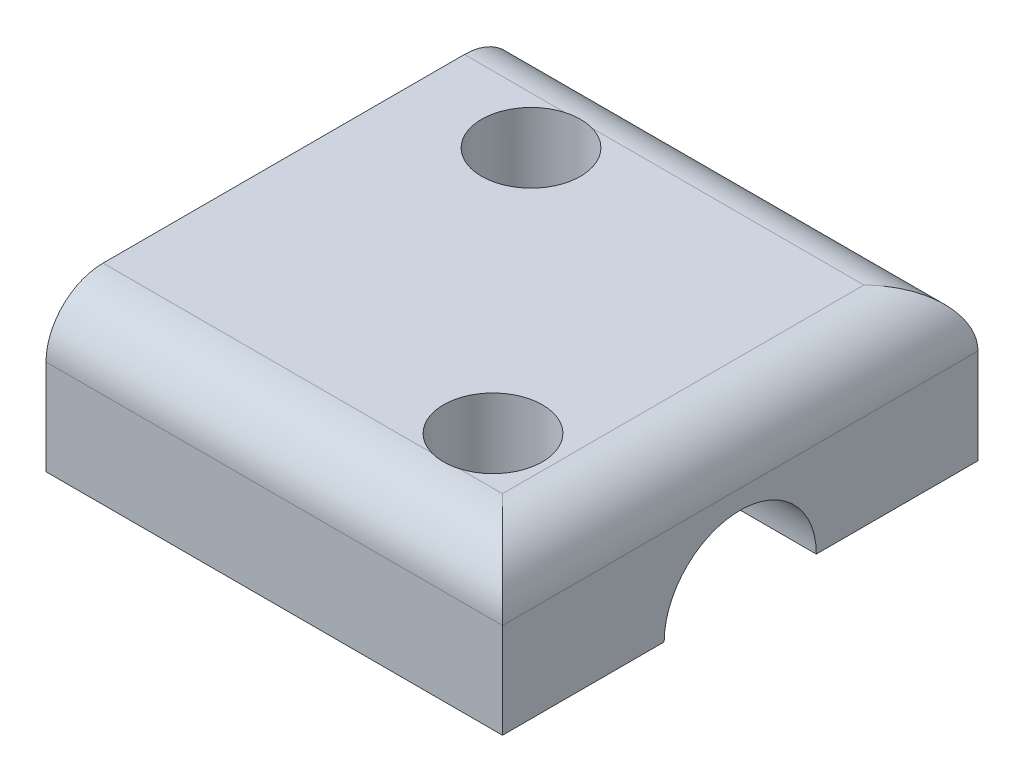
ISO-10303-21;
HEADER;
FILE_DESCRIPTION(('STEP AP214'),'2;1');
FILE_NAME('part.step','',(''),(''),'','','');
FILE_SCHEMA(('AUTOMOTIVE_DESIGN { 1 0 10303 214 1 1 1 1 }'));
ENDSEC;
DATA;
#1=APPLICATION_CONTEXT('core data for automotive mechanical design processes');
#2=APPLICATION_PROTOCOL_DEFINITION('international standard','automotive_design',2000,#1);
#3=PRODUCT_CONTEXT('',#1,'mechanical');
#4=PRODUCT('Part','Part','',(#3));
#5=PRODUCT_RELATED_PRODUCT_CATEGORY('part','',(#4));
#6=PRODUCT_DEFINITION_FORMATION('','',#4);
#7=PRODUCT_DEFINITION_CONTEXT('part definition',#1,'design');
#8=PRODUCT_DEFINITION('design','',#6,#7);
#9=PRODUCT_DEFINITION_SHAPE('','',#8);
#10=(LENGTH_UNIT() NAMED_UNIT(*) SI_UNIT(.MILLI.,.METRE.));
#11=(NAMED_UNIT(*) PLANE_ANGLE_UNIT() SI_UNIT($,.RADIAN.));
#12=(NAMED_UNIT(*) SI_UNIT($,.STERADIAN.) SOLID_ANGLE_UNIT());
#13=UNCERTAINTY_MEASURE_WITH_UNIT(LENGTH_MEASURE(1.E-05),#10,'distance_accuracy_value','');
#14=(GEOMETRIC_REPRESENTATION_CONTEXT(3) GLOBAL_UNCERTAINTY_ASSIGNED_CONTEXT((#13)) GLOBAL_UNIT_ASSIGNED_CONTEXT((#10,
#11,#12)) REPRESENTATION_CONTEXT('',''));
#15=CARTESIAN_POINT('',(0.,0.,0.));
#16=DIRECTION('',(0.,0.,1.));
#17=DIRECTION('',(1.,0.,0.));
#18=AXIS2_PLACEMENT_3D('',#15,#16,#17);
#19=CARTESIAN_POINT('',(0.,0.,0.));
#20=DIRECTION('',(0.,1.,0.));
#21=DIRECTION('',(0.,0.,1.));
#22=AXIS2_PLACEMENT_3D('',#19,#20,#21);
#23=PLANE('',#22);
#24=CARTESIAN_POINT('',(-6.,0.,-6.99999999999998));
#25=DIRECTION('',(0.,-1.,0.));
#26=DIRECTION('',(0.,0.,-1.));
#27=AXIS2_PLACEMENT_3D('',#24,#25,#26);
#28=CIRCLE('',#27,2.6);
#29=CARTESIAN_POINT('',(-6.,0.,-9.59999999999998));
#30=VERTEX_POINT('',#29);
#31=EDGE_CURVE('E227',#30,#30,#28,.T.);
#32=ORIENTED_EDGE('',*,*,#31,.F.);
#33=EDGE_LOOP('',(#32));
#34=FACE_BOUND('',#33,.T.);
#35=DIRECTION('',(0.,0.,-1.));
#36=VECTOR('',#35,1.);
#37=CARTESIAN_POINT('',(12.,0.,-12.5));
#38=LINE('',#37,#36);
#39=CARTESIAN_POINT('',(12.,0.,-4.00000000000001));
#40=VERTEX_POINT('',#39);
#41=CARTESIAN_POINT('',(12.,0.,-12.5));
#42=VERTEX_POINT('',#41);
#43=EDGE_CURVE('E231',#40,#42,#38,.T.);
#44=ORIENTED_EDGE('',*,*,#43,.F.);
#45=DIRECTION('',(-1.,0.,0.));
#46=VECTOR('',#45,1.);
#47=CARTESIAN_POINT('',(12.,0.,-4.));
#48=LINE('',#47,#46);
#49=CARTESIAN_POINT('',(-12.,0.,-4.));
#50=VERTEX_POINT('',#49);
#51=EDGE_CURVE('E133',#40,#50,#48,.T.);
#52=ORIENTED_EDGE('',*,*,#51,.T.);
#53=DIRECTION('',(0.,0.,1.));
#54=VECTOR('',#53,1.);
#55=CARTESIAN_POINT('',(-12.,0.,-12.5));
#56=LINE('',#55,#54);
#57=CARTESIAN_POINT('',(-12.,0.,-12.5));
#58=VERTEX_POINT('',#57);
#59=EDGE_CURVE('E145',#58,#50,#56,.T.);
#60=ORIENTED_EDGE('',*,*,#59,.F.);
#61=DIRECTION('',(-1.,0.,0.));
#62=VECTOR('',#61,1.);
#63=CARTESIAN_POINT('',(-12.,0.,-12.5));
#64=LINE('',#63,#62);
#65=EDGE_CURVE('E151',#42,#58,#64,.T.);
#66=ORIENTED_EDGE('',*,*,#65,.F.);
#67=EDGE_LOOP('',(#44,#52,#60,#66));
#68=FACE_BOUND('',#67,.T.);
#69=ADVANCED_FACE('F43',(#34,#68),#23,.F.);
#70=CARTESIAN_POINT('',(12.,8.,-12.5));
#71=DIRECTION('',(-1.,0.,0.));
#72=DIRECTION('',(0.,0.,1.));
#73=AXIS2_PLACEMENT_3D('',#70,#71,#72);
#74=PLANE('',#73);
#75=DIRECTION('',(0.,-1.,0.));
#76=VECTOR('',#75,1.);
#77=CARTESIAN_POINT('',(12.,8.,-12.5));
#78=LINE('',#77,#76);
#79=CARTESIAN_POINT('',(12.,5.,-12.5));
#80=VERTEX_POINT('',#79);
#81=EDGE_CURVE('E134',#80,#42,#78,.T.);
#82=ORIENTED_EDGE('',*,*,#81,.F.);
#83=DIRECTION('',(0.,0.,-1.));
#84=VECTOR('',#83,1.);
#85=CARTESIAN_POINT('',(12.,5.,12.5));
#86=LINE('',#85,#84);
#87=CARTESIAN_POINT('',(12.,5.,12.5));
#88=VERTEX_POINT('',#87);
#89=EDGE_CURVE('E61',#80,#88,#86,.F.);
#90=ORIENTED_EDGE('',*,*,#89,.T.);
#91=DIRECTION('',(0.,-1.,0.));
#92=VECTOR('',#91,1.);
#93=CARTESIAN_POINT('',(12.,8.,12.5));
#94=LINE('',#93,#92);
#95=CARTESIAN_POINT('',(12.,0.,12.5));
#96=VERTEX_POINT('',#95);
#97=EDGE_CURVE('E160',#88,#96,#94,.T.);
#98=ORIENTED_EDGE('',*,*,#97,.T.);
#99=CARTESIAN_POINT('',(12.,0.,3.99999999999999));
#100=VERTEX_POINT('',#99);
#101=EDGE_CURVE('E154',#96,#100,#38,.T.);
#102=ORIENTED_EDGE('',*,*,#101,.T.);
#103=CARTESIAN_POINT('',(12.,0.,0.));
#104=DIRECTION('',(-1.,0.,0.));
#105=DIRECTION('',(0.,0.,1.));
#106=AXIS2_PLACEMENT_3D('',#103,#104,#105);
#107=CIRCLE('',#106,4.);
#108=EDGE_CURVE('E128',#100,#40,#107,.T.);
#109=ORIENTED_EDGE('',*,*,#108,.T.);
#110=ORIENTED_EDGE('',*,*,#43,.T.);
#111=EDGE_LOOP('',(#82,#90,#98,#102,#109,#110));
#112=FACE_BOUND('',#111,.T.);
#113=ADVANCED_FACE('F237',(#112),#74,.F.);
#114=CARTESIAN_POINT('',(-12.,8.,-12.5));
#115=DIRECTION('',(0.,0.,1.));
#116=DIRECTION('',(1.,0.,0.));
#117=AXIS2_PLACEMENT_3D('',#114,#115,#116);
#118=PLANE('',#117);
#119=DIRECTION('',(0.,-1.,0.));
#120=VECTOR('',#119,1.);
#121=CARTESIAN_POINT('',(-12.,8.,-12.5));
#122=LINE('',#121,#120);
#123=CARTESIAN_POINT('',(-12.,5.,-12.5));
#124=VERTEX_POINT('',#123);
#125=EDGE_CURVE('E164',#124,#58,#122,.T.);
#126=ORIENTED_EDGE('',*,*,#125,.F.);
#127=DIRECTION('',(-1.,0.,0.));
#128=VECTOR('',#127,1.);
#129=CARTESIAN_POINT('',(12.,5.,-12.5));
#130=LINE('',#129,#128);
#131=EDGE_CURVE('E69',#124,#80,#130,.F.);
#132=ORIENTED_EDGE('',*,*,#131,.T.);
#133=ORIENTED_EDGE('',*,*,#81,.T.);
#134=ORIENTED_EDGE('',*,*,#65,.T.);
#135=EDGE_LOOP('',(#126,#132,#133,#134));
#136=FACE_BOUND('',#135,.T.);
#137=ADVANCED_FACE('F239',(#136),#118,.F.);
#138=CARTESIAN_POINT('',(-12.,8.,-12.5));
#139=DIRECTION('',(1.,0.,0.));
#140=DIRECTION('',(0.,0.,-1.));
#141=AXIS2_PLACEMENT_3D('',#138,#139,#140);
#142=PLANE('',#141);
#143=DIRECTION('',(0.,0.,1.));
#144=VECTOR('',#143,1.);
#145=CARTESIAN_POINT('',(-12.,8.,-12.5));
#146=LINE('',#145,#144);
#147=CARTESIAN_POINT('',(-12.,8.,-9.5));
#148=VERTEX_POINT('',#147);
#149=CARTESIAN_POINT('',(-12.,8.,9.5));
#150=VERTEX_POINT('',#149);
#151=EDGE_CURVE('E159',#148,#150,#146,.T.);
#152=ORIENTED_EDGE('',*,*,#151,.F.);
#153=CARTESIAN_POINT('',(-12.,5.,-9.5));
#154=DIRECTION('',(1.,0.,0.));
#155=DIRECTION('',(0.,0.,-1.));
#156=AXIS2_PLACEMENT_3D('',#153,#154,#155);
#157=CIRCLE('',#156,3.);
#158=EDGE_CURVE('E242',#148,#124,#157,.F.);
#159=ORIENTED_EDGE('',*,*,#158,.T.);
#160=ORIENTED_EDGE('',*,*,#125,.T.);
#161=ORIENTED_EDGE('',*,*,#59,.T.);
#162=CARTESIAN_POINT('',(-12.,0.,0.));
#163=DIRECTION('',(-1.,0.,0.));
#164=DIRECTION('',(0.,0.,1.));
#165=AXIS2_PLACEMENT_3D('',#162,#163,#164);
#166=CIRCLE('',#165,4.);
#167=CARTESIAN_POINT('',(-12.,0.,4.));
#168=VERTEX_POINT('',#167);
#169=EDGE_CURVE('E125',#168,#50,#166,.T.);
#170=ORIENTED_EDGE('',*,*,#169,.F.);
#171=CARTESIAN_POINT('',(-12.,0.,12.5));
#172=VERTEX_POINT('',#171);
#173=EDGE_CURVE('E142',#168,#172,#56,.T.);
#174=ORIENTED_EDGE('',*,*,#173,.T.);
#175=DIRECTION('',(0.,-1.,0.));
#176=VECTOR('',#175,1.);
#177=CARTESIAN_POINT('',(-12.,8.,12.5));
#178=LINE('',#177,#176);
#179=CARTESIAN_POINT('',(-12.,5.,12.5));
#180=VERTEX_POINT('',#179);
#181=EDGE_CURVE('E162',#180,#172,#178,.T.);
#182=ORIENTED_EDGE('',*,*,#181,.F.);
#183=CARTESIAN_POINT('',(-12.,5.,9.5));
#184=DIRECTION('',(1.,0.,0.));
#185=DIRECTION('',(0.,0.,-1.));
#186=AXIS2_PLACEMENT_3D('',#183,#184,#185);
#187=CIRCLE('',#186,3.);
#188=EDGE_CURVE('E187',#180,#150,#187,.F.);
#189=ORIENTED_EDGE('',*,*,#188,.T.);
#190=EDGE_LOOP('',(#152,#159,#160,#161,#170,#174,#182,#189));
#191=FACE_BOUND('',#190,.T.);
#192=ADVANCED_FACE('F140',(#191),#142,.F.);
#193=CARTESIAN_POINT('',(-12.,8.,12.5));
#194=DIRECTION('',(0.,0.,-1.));
#195=DIRECTION('',(-1.,0.,0.));
#196=AXIS2_PLACEMENT_3D('',#193,#194,#195);
#197=PLANE('',#196);
#198=ORIENTED_EDGE('',*,*,#97,.F.);
#199=DIRECTION('',(1.,0.,0.));
#200=VECTOR('',#199,1.);
#201=CARTESIAN_POINT('',(-12.,5.,12.5));
#202=LINE('',#201,#200);
#203=EDGE_CURVE('E11',#88,#180,#202,.F.);
#204=ORIENTED_EDGE('',*,*,#203,.T.);
#205=ORIENTED_EDGE('',*,*,#181,.T.);
#206=DIRECTION('',(1.,0.,0.));
#207=VECTOR('',#206,1.);
#208=CARTESIAN_POINT('',(-12.,0.,12.5));
#209=LINE('',#208,#207);
#210=EDGE_CURVE('E150',#172,#96,#209,.T.);
#211=ORIENTED_EDGE('',*,*,#210,.T.);
#212=EDGE_LOOP('',(#198,#204,#205,#211));
#213=FACE_BOUND('',#212,.T.);
#214=ADVANCED_FACE('F260',(#213),#197,.F.);
#215=CARTESIAN_POINT('',(0.,8.,0.));
#216=DIRECTION('',(0.,1.,0.));
#217=DIRECTION('',(0.,0.,1.));
#218=AXIS2_PLACEMENT_3D('',#215,#216,#217);
#219=PLANE('',#218);
#220=CARTESIAN_POINT('',(-6.,8.,-6.99999999999998));
#221=DIRECTION('',(0.,-1.,0.));
#222=DIRECTION('',(0.,0.,-1.));
#223=AXIS2_PLACEMENT_3D('',#220,#221,#222);
#224=CIRCLE('',#223,2.6);
#225=CARTESIAN_POINT('',(-5.28585715714578,8.,-9.5));
#226=VERTEX_POINT('',#225);
#227=CARTESIAN_POINT('',(-6.71414284285422,8.,-9.5));
#228=VERTEX_POINT('',#227);
#229=EDGE_CURVE('E146',#226,#228,#224,.T.);
#230=ORIENTED_EDGE('',*,*,#229,.T.);
#231=DIRECTION('',(-1.,0.,0.));
#232=VECTOR('',#231,1.);
#233=CARTESIAN_POINT('',(-12.,8.,-9.5));
#234=LINE('',#233,#232);
#235=EDGE_CURVE('E177',#228,#148,#234,.T.);
#236=ORIENTED_EDGE('',*,*,#235,.T.);
#237=ORIENTED_EDGE('',*,*,#151,.T.);
#238=DIRECTION('',(1.,0.,0.));
#239=VECTOR('',#238,1.);
#240=CARTESIAN_POINT('',(12.,8.,9.5));
#241=LINE('',#240,#239);
#242=CARTESIAN_POINT('',(5.28585715714565,8.,9.5));
#243=VERTEX_POINT('',#242);
#244=EDGE_CURVE('E175',#150,#243,#241,.T.);
#245=ORIENTED_EDGE('',*,*,#244,.T.);
#246=CARTESIAN_POINT('',(5.99999999999999,8.,7.00000000000002));
#247=DIRECTION('',(0.,-1.,0.));
#248=DIRECTION('',(0.,0.,-1.));
#249=AXIS2_PLACEMENT_3D('',#246,#247,#248);
#250=CIRCLE('',#249,2.6);
#251=CARTESIAN_POINT('',(6.71414284285434,8.,9.5));
#252=VERTEX_POINT('',#251);
#253=EDGE_CURVE('E216',#243,#252,#250,.T.);
#254=ORIENTED_EDGE('',*,*,#253,.T.);
#255=DIRECTION('',(1.,0.,0.));
#256=VECTOR('',#255,1.);
#257=CARTESIAN_POINT('',(12.,8.,9.5));
#258=LINE('',#257,#256);
#259=CARTESIAN_POINT('',(9.,8.,9.5));
#260=VERTEX_POINT('',#259);
#261=EDGE_CURVE('E168',#252,#260,#258,.T.);
#262=ORIENTED_EDGE('',*,*,#261,.T.);
#263=DIRECTION('',(0.,0.,-1.));
#264=VECTOR('',#263,1.);
#265=CARTESIAN_POINT('',(9.,8.,-12.5));
#266=LINE('',#265,#264);
#267=CARTESIAN_POINT('',(9.,8.,-9.5));
#268=VERTEX_POINT('',#267);
#269=EDGE_CURVE('E170',#260,#268,#266,.T.);
#270=ORIENTED_EDGE('',*,*,#269,.T.);
#271=DIRECTION('',(-1.,0.,0.));
#272=VECTOR('',#271,1.);
#273=CARTESIAN_POINT('',(-12.,8.,-9.5));
#274=LINE('',#273,#272);
#275=EDGE_CURVE('E172',#268,#226,#274,.T.);
#276=ORIENTED_EDGE('',*,*,#275,.T.);
#277=EDGE_LOOP('',(#230,#236,#237,#245,#254,#262,#270,#276));
#278=FACE_BOUND('',#277,.T.);
#279=ADVANCED_FACE('F248',(#278),#219,.T.);
#280=CARTESIAN_POINT('',(5.99999999999999,0.,7.00000000000002));
#281=DIRECTION('',(0.,-1.,0.));
#282=DIRECTION('',(0.,0.,-1.));
#283=AXIS2_PLACEMENT_3D('',#280,#281,#282);
#284=CIRCLE('',#283,2.6);
#285=CARTESIAN_POINT('',(5.99999999999999,0.,4.40000000000001));
#286=VERTEX_POINT('',#285);
#287=EDGE_CURVE('E221',#286,#286,#284,.T.);
#288=ORIENTED_EDGE('',*,*,#287,.F.);
#289=EDGE_LOOP('',(#288));
#290=FACE_BOUND('',#289,.T.);
#291=ORIENTED_EDGE('',*,*,#173,.F.);
#292=DIRECTION('',(-1.,0.,0.));
#293=VECTOR('',#292,1.);
#294=CARTESIAN_POINT('',(12.,0.,3.99999999999999));
#295=LINE('',#294,#293);
#296=EDGE_CURVE('E122',#168,#100,#295,.F.);
#297=ORIENTED_EDGE('',*,*,#296,.T.);
#298=ORIENTED_EDGE('',*,*,#101,.F.);
#299=ORIENTED_EDGE('',*,*,#210,.F.);
#300=EDGE_LOOP('',(#291,#297,#298,#299));
#301=FACE_BOUND('',#300,.T.);
#302=ADVANCED_FACE('F148',(#290,#301),#23,.F.);
#303=CARTESIAN_POINT('',(12.,0.,0.));
#304=DIRECTION('',(-1.,0.,0.));
#305=DIRECTION('',(0.,0.,1.));
#306=AXIS2_PLACEMENT_3D('',#303,#304,#305);
#307=CYLINDRICAL_SURFACE('',#306,4.);
#308=ORIENTED_EDGE('',*,*,#108,.F.);
#309=ORIENTED_EDGE('',*,*,#296,.F.);
#310=ORIENTED_EDGE('',*,*,#169,.T.);
#311=ORIENTED_EDGE('',*,*,#51,.F.);
#312=EDGE_LOOP('',(#308,#309,#310,#311));
#313=FACE_BOUND('',#312,.T.);
#314=ADVANCED_FACE('F124',(#313),#307,.F.);
#315=CARTESIAN_POINT('',(5.99999999999999,8.,7.00000000000002));
#316=DIRECTION('',(0.,-1.,0.));
#317=DIRECTION('',(0.,0.,-1.));
#318=AXIS2_PLACEMENT_3D('',#315,#316,#317);
#319=CYLINDRICAL_SURFACE('',#318,2.6);
#320=ORIENTED_EDGE('',*,*,#253,.F.);
#321=CARTESIAN_POINT('',(5.28585715714565,8.,9.5));
#322=CARTESIAN_POINT('',(5.35694919625492,7.99998041833804,9.52031619109937));
#323=CARTESIAN_POINT('',(5.42890987822449,7.99979278980155,9.5375841845331));
#324=CARTESIAN_POINT('',(5.57405455969822,7.99931410750979,9.56593617730904));
#325=CARTESIAN_POINT('',(5.64723880714189,7.99902303254433,9.57701890725487));
#326=CARTESIAN_POINT('',(5.79260665753235,7.99857549826108,9.59272283319133));
#327=CARTESIAN_POINT('',(5.86477490245482,7.99841611435178,9.59748591817973));
#328=CARTESIAN_POINT('',(6.00922505909283,7.99830035195138,9.60098731820107));
#329=CARTESIAN_POINT('',(6.08150692629877,7.99834390756972,9.59972758872249));
#330=CARTESIAN_POINT('',(6.24769287166116,7.99865965182706,9.58988764866424));
#331=CARTESIAN_POINT('',(6.34148438040999,7.99899737142083,9.57919675295137));
#332=CARTESIAN_POINT('',(6.48154908654678,7.99949706327471,9.55546556852627));
#333=CARTESIAN_POINT('',(6.52849032246857,7.99966372750928,9.54617119530564));
#334=CARTESIAN_POINT('',(6.62178581615362,7.99991404375928,9.52500862847828));
#335=CARTESIAN_POINT('',(6.66814011396776,7.99999770146929,9.51314061150187));
#336=CARTESIAN_POINT('',(6.71414284285434,8.,9.5));
#337=B_SPLINE_CURVE_WITH_KNOTS('',3,(#321,#322,#323,#324,#325,#326,#327,#328,#329,#330,#331,
#332,#333,#334,#335,#336),.UNSPECIFIED.,.F.,.F.,(4,2,2,2,2,2,2,4),(0.,0.221743370898095,
0.443532233280988,0.660252121844597,0.876901650535021,1.15946810324269,1.30296503050942,
1.44645211263273),.UNSPECIFIED.);
#338=EDGE_CURVE('E53',#243,#252,#337,.T.);
#339=ORIENTED_EDGE('',*,*,#338,.T.);
#340=EDGE_LOOP('',(#320,#339));
#341=FACE_BOUND('',#340,.T.);
#342=ORIENTED_EDGE('',*,*,#287,.T.);
#343=EDGE_LOOP('',(#342));
#344=FACE_BOUND('',#343,.T.);
#345=ADVANCED_FACE('F196',(#341,#344),#319,.F.);
#346=CARTESIAN_POINT('',(-6.,8.,-6.99999999999998));
#347=DIRECTION('',(0.,-1.,0.));
#348=DIRECTION('',(0.,0.,-1.));
#349=AXIS2_PLACEMENT_3D('',#346,#347,#348);
#350=CYLINDRICAL_SURFACE('',#349,2.6);
#351=ORIENTED_EDGE('',*,*,#229,.F.);
#352=CARTESIAN_POINT('',(-5.28585715714578,8.,-9.5));
#353=CARTESIAN_POINT('',(-5.35694919625505,7.99998041833804,-9.52031619109937));
#354=CARTESIAN_POINT('',(-5.42890987822462,7.99979278980155,-9.5375841845331));
#355=CARTESIAN_POINT('',(-5.57405455969835,7.99931410750979,-9.56593617730902));
#356=CARTESIAN_POINT('',(-5.64723880714202,7.99902303254433,-9.57701890725485));
#357=CARTESIAN_POINT('',(-5.79260665753248,7.99857549826108,-9.5927228331913));
#358=CARTESIAN_POINT('',(-5.86477490245495,7.99841611435178,-9.59748591817971));
#359=CARTESIAN_POINT('',(-6.00922505909296,7.99830035195138,-9.60098731820103));
#360=CARTESIAN_POINT('',(-6.0815069262989,7.99834390756973,-9.59972758872245));
#361=CARTESIAN_POINT('',(-6.24769287166125,7.99865965182706,-9.5898876486642));
#362=CARTESIAN_POINT('',(-6.34148438041004,7.99899737142084,-9.57919675295133));
#363=CARTESIAN_POINT('',(-6.48154908654677,7.99949706327471,-9.55546556852624));
#364=CARTESIAN_POINT('',(-6.52849032246854,7.99966372750928,-9.54617119530561));
#365=CARTESIAN_POINT('',(-6.62178581615355,7.99991404375928,-9.52500862847826));
#366=CARTESIAN_POINT('',(-6.66814011396766,7.99999770146929,-9.51314061150186));
#367=CARTESIAN_POINT('',(-6.71414284285422,8.,-9.5));
#368=B_SPLINE_CURVE_WITH_KNOTS('',3,(#352,#353,#354,#355,#356,#357,#358,#359,#360,#361,#362,
#363,#364,#365,#366,#367),.UNSPECIFIED.,.F.,.F.,(4,2,2,2,2,2,2,4),(0.,0.221743370898094,
0.443532233280986,0.660252121844594,0.876901650535019,1.15946810324257,1.30296503050923,
1.44645211263247),.UNSPECIFIED.);
#369=EDGE_CURVE('E179',#226,#228,#368,.T.);
#370=ORIENTED_EDGE('',*,*,#369,.T.);
#371=EDGE_LOOP('',(#351,#370));
#372=FACE_BOUND('',#371,.T.);
#373=ORIENTED_EDGE('',*,*,#31,.T.);
#374=EDGE_LOOP('',(#373));
#375=FACE_BOUND('',#374,.T.);
#376=ADVANCED_FACE('F192',(#372,#375),#350,.F.);
#377=CARTESIAN_POINT('',(0.,5.,9.5));
#378=DIRECTION('',(-1.,0.,0.));
#379=DIRECTION('',(0.,0.,1.));
#380=AXIS2_PLACEMENT_3D('',#377,#378,#379);
#381=CYLINDRICAL_SURFACE('',#380,3.);
#382=ORIENTED_EDGE('',*,*,#188,.F.);
#383=ORIENTED_EDGE('',*,*,#203,.F.);
#384=CARTESIAN_POINT('',(9.,5.,9.5));
#385=DIRECTION('',(-0.707106781186547,0.,0.707106781186548));
#386=DIRECTION('',(-0.707106781186548,0.,-0.707106781186547));
#387=AXIS2_PLACEMENT_3D('',#384,#385,#386);
#388=ELLIPSE('',#387,4.24264068711929,3.);
#389=EDGE_CURVE('E48',#260,#88,#388,.F.);
#390=ORIENTED_EDGE('',*,*,#389,.F.);
#391=ORIENTED_EDGE('',*,*,#261,.F.);
#392=ORIENTED_EDGE('',*,*,#338,.F.);
#393=ORIENTED_EDGE('',*,*,#244,.F.);
#394=EDGE_LOOP('',(#382,#383,#390,#391,#392,#393));
#395=FACE_BOUND('',#394,.T.);
#396=ADVANCED_FACE('F45',(#395),#381,.T.);
#397=CARTESIAN_POINT('',(9.,5.,0.));
#398=DIRECTION('',(0.,0.,1.));
#399=DIRECTION('',(1.,0.,0.));
#400=AXIS2_PLACEMENT_3D('',#397,#398,#399);
#401=CYLINDRICAL_SURFACE('',#400,3.);
#402=ORIENTED_EDGE('',*,*,#389,.T.);
#403=ORIENTED_EDGE('',*,*,#89,.F.);
#404=CARTESIAN_POINT('',(9.,5.,-9.5));
#405=DIRECTION('',(0.707106781186548,0.,0.707106781186547));
#406=DIRECTION('',(-0.707106781186547,0.,0.707106781186548));
#407=AXIS2_PLACEMENT_3D('',#404,#405,#406);
#408=ELLIPSE('',#407,4.24264068711928,3.);
#409=EDGE_CURVE('E210',#268,#80,#408,.F.);
#410=ORIENTED_EDGE('',*,*,#409,.F.);
#411=ORIENTED_EDGE('',*,*,#269,.F.);
#412=EDGE_LOOP('',(#402,#403,#410,#411));
#413=FACE_BOUND('',#412,.T.);
#414=ADVANCED_FACE('F273',(#413),#401,.T.);
#415=CARTESIAN_POINT('',(0.,5.,-9.5));
#416=DIRECTION('',(1.,0.,0.));
#417=DIRECTION('',(0.,0.,-1.));
#418=AXIS2_PLACEMENT_3D('',#415,#416,#417);
#419=CYLINDRICAL_SURFACE('',#418,3.);
#420=ORIENTED_EDGE('',*,*,#409,.T.);
#421=ORIENTED_EDGE('',*,*,#131,.F.);
#422=ORIENTED_EDGE('',*,*,#158,.F.);
#423=ORIENTED_EDGE('',*,*,#235,.F.);
#424=ORIENTED_EDGE('',*,*,#369,.F.);
#425=ORIENTED_EDGE('',*,*,#275,.F.);
#426=EDGE_LOOP('',(#420,#421,#422,#423,#424,#425));
#427=FACE_BOUND('',#426,.T.);
#428=ADVANCED_FACE('F189',(#427),#419,.T.);
#429=CLOSED_SHELL('',(#69,#113,#137,#192,#214,#279,#302,#314,#345,#376,#396,#414,#428));
#430=MANIFOLD_SOLID_BREP('B2',#429);
#431=ADVANCED_BREP_SHAPE_REPRESENTATION('',(#18,#430),#14);
#432=SHAPE_DEFINITION_REPRESENTATION(#9,#431);
ENDSEC;
END-ISO-10303-21;
